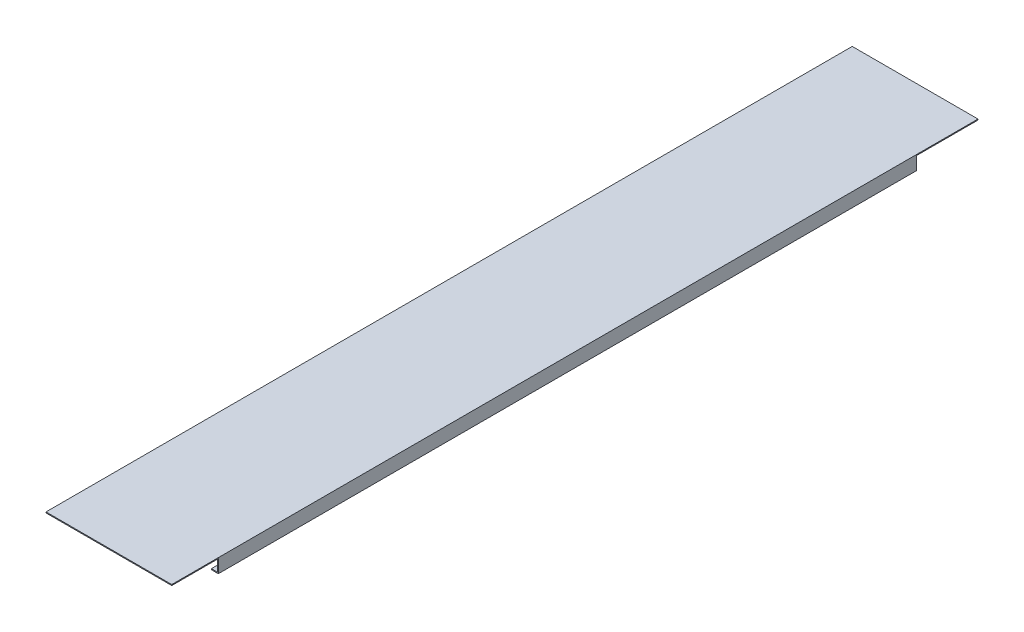
ISO-10303-21;
HEADER;
FILE_DESCRIPTION(('STEP AP214'),'2;1');
FILE_NAME('part.step','',(''),(''),'','','');
FILE_SCHEMA(('AUTOMOTIVE_DESIGN { 1 0 10303 214 1 1 1 1 }'));
ENDSEC;
DATA;
#1=APPLICATION_CONTEXT('core data for automotive mechanical design processes');
#2=APPLICATION_PROTOCOL_DEFINITION('international standard','automotive_design',2000,#1);
#3=PRODUCT_CONTEXT('',#1,'mechanical');
#4=PRODUCT('Part','Part','',(#3));
#5=PRODUCT_RELATED_PRODUCT_CATEGORY('part','',(#4));
#6=PRODUCT_DEFINITION_FORMATION('','',#4);
#7=PRODUCT_DEFINITION_CONTEXT('part definition',#1,'design');
#8=PRODUCT_DEFINITION('design','',#6,#7);
#9=PRODUCT_DEFINITION_SHAPE('','',#8);
#10=(LENGTH_UNIT() NAMED_UNIT(*) SI_UNIT(.MILLI.,.METRE.));
#11=(NAMED_UNIT(*) PLANE_ANGLE_UNIT() SI_UNIT($,.RADIAN.));
#12=(NAMED_UNIT(*) SI_UNIT($,.STERADIAN.) SOLID_ANGLE_UNIT());
#13=UNCERTAINTY_MEASURE_WITH_UNIT(LENGTH_MEASURE(1.E-05),#10,'distance_accuracy_value','');
#14=(GEOMETRIC_REPRESENTATION_CONTEXT(3) GLOBAL_UNCERTAINTY_ASSIGNED_CONTEXT((#13)) GLOBAL_UNIT_ASSIGNED_CONTEXT((#10,
#11,#12)) REPRESENTATION_CONTEXT('',''));
#15=CARTESIAN_POINT('',(0.,0.,0.));
#16=DIRECTION('',(0.,0.,1.));
#17=DIRECTION('',(1.,0.,0.));
#18=AXIS2_PLACEMENT_3D('',#15,#16,#17);
#19=CARTESIAN_POINT('',(-363.,-1048.,2035.));
#20=DIRECTION('',(0.,-1.,0.));
#21=DIRECTION('',(1.,0.,0.));
#22=AXIS2_PLACEMENT_3D('',#19,#20,#21);
#23=PLANE('',#22);
#24=DIRECTION('',(0.,0.,-1.));
#25=VECTOR('',#24,1.);
#26=CARTESIAN_POINT('',(-348.,-1048.,1925.));
#27=LINE('',#26,#25);
#28=CARTESIAN_POINT('',(-348.,-1048.,1925.));
#29=VERTEX_POINT('',#28);
#30=CARTESIAN_POINT('',(-348.,-1048.,426.));
#31=VERTEX_POINT('',#30);
#32=EDGE_CURVE('E194',#29,#31,#27,.T.);
#33=ORIENTED_EDGE('',*,*,#32,.F.);
#34=DIRECTION('',(1.,0.,0.));
#35=VECTOR('',#34,1.);
#36=CARTESIAN_POINT('',(-363.,-1048.,1925.));
#37=LINE('',#36,#35);
#38=CARTESIAN_POINT('',(-363.,-1048.,1925.));
#39=VERTEX_POINT('',#38);
#40=EDGE_CURVE('E36',#39,#29,#37,.T.);
#41=ORIENTED_EDGE('',*,*,#40,.F.);
#42=DIRECTION('',(0.,0.,-1.));
#43=VECTOR('',#42,1.);
#44=CARTESIAN_POINT('',(-363.,-1048.,1925.));
#45=LINE('',#44,#43);
#46=CARTESIAN_POINT('',(-363.,-1048.,426.));
#47=VERTEX_POINT('',#46);
#48=EDGE_CURVE('E11',#39,#47,#45,.T.);
#49=ORIENTED_EDGE('',*,*,#48,.T.);
#50=DIRECTION('',(1.,0.,0.));
#51=VECTOR('',#50,1.);
#52=CARTESIAN_POINT('',(-363.,-1048.,426.));
#53=LINE('',#52,#51);
#54=EDGE_CURVE('E27',#47,#31,#53,.T.);
#55=ORIENTED_EDGE('',*,*,#54,.T.);
#56=EDGE_LOOP('',(#33,#41,#49,#55));
#57=FACE_BOUND('',#56,.T.);
#58=ADVANCED_FACE('F17',(#57),#23,.T.);
#59=CARTESIAN_POINT('',(-618.,-1020.,426.));
#60=DIRECTION('',(0.,0.,1.));
#61=DIRECTION('',(1.,0.,0.));
#62=AXIS2_PLACEMENT_3D('',#59,#60,#61);
#63=PLANE('',#62);
#64=DIRECTION('',(0.,-1.,0.));
#65=VECTOR('',#64,1.);
#66=CARTESIAN_POINT('',(-363.,-1046.,426.));
#67=LINE('',#66,#65);
#68=CARTESIAN_POINT('',(-363.,-1046.,426.));
#69=VERTEX_POINT('',#68);
#70=EDGE_CURVE('E187',#69,#47,#67,.T.);
#71=ORIENTED_EDGE('',*,*,#70,.F.);
#72=DIRECTION('',(-1.,0.,0.));
#73=VECTOR('',#72,1.);
#74=CARTESIAN_POINT('',(-350.,-1046.,426.));
#75=LINE('',#74,#73);
#76=CARTESIAN_POINT('',(-350.,-1046.,426.));
#77=VERTEX_POINT('',#76);
#78=EDGE_CURVE('E108',#77,#69,#75,.T.);
#79=ORIENTED_EDGE('',*,*,#78,.F.);
#80=DIRECTION('',(0.,-1.,0.));
#81=VECTOR('',#80,1.);
#82=CARTESIAN_POINT('',(-350.,-1020.,426.));
#83=LINE('',#82,#81);
#84=CARTESIAN_POINT('',(-350.,-1020.,426.));
#85=VERTEX_POINT('',#84);
#86=EDGE_CURVE('E101',#85,#77,#83,.T.);
#87=ORIENTED_EDGE('',*,*,#86,.F.);
#88=DIRECTION('',(1.,0.,0.));
#89=VECTOR('',#88,1.);
#90=CARTESIAN_POINT('',(-350.,-1020.,426.));
#91=LINE('',#90,#89);
#92=CARTESIAN_POINT('',(-348.,-1020.,426.));
#93=VERTEX_POINT('',#92);
#94=EDGE_CURVE('E106',#85,#93,#91,.T.);
#95=ORIENTED_EDGE('',*,*,#94,.T.);
#96=DIRECTION('',(0.,1.,0.));
#97=VECTOR('',#96,1.);
#98=CARTESIAN_POINT('',(-348.,-1048.,426.));
#99=LINE('',#98,#97);
#100=EDGE_CURVE('E165',#31,#93,#99,.T.);
#101=ORIENTED_EDGE('',*,*,#100,.F.);
#102=ORIENTED_EDGE('',*,*,#54,.F.);
#103=EDGE_LOOP('',(#71,#79,#87,#95,#101,#102));
#104=FACE_BOUND('',#103,.T.);
#105=ADVANCED_FACE('F104',(#104),#63,.F.);
#106=CARTESIAN_POINT('',(-618.,-1020.,426.));
#107=DIRECTION('',(0.,0.,1.));
#108=DIRECTION('',(1.,0.,0.));
#109=AXIS2_PLACEMENT_3D('',#106,#107,#108);
#110=PLANE('',#109);
#111=DIRECTION('',(1.,0.,0.));
#112=VECTOR('',#111,1.);
#113=CARTESIAN_POINT('',(-618.,-1020.,426.));
#114=LINE('',#113,#112);
#115=CARTESIAN_POINT('',(-618.,-1020.,426.));
#116=VERTEX_POINT('',#115);
#117=CARTESIAN_POINT('',(-616.,-1020.,426.));
#118=VERTEX_POINT('',#117);
#119=EDGE_CURVE('E123',#116,#118,#114,.T.);
#120=ORIENTED_EDGE('',*,*,#119,.T.);
#121=DIRECTION('',(0.,1.,0.));
#122=VECTOR('',#121,1.);
#123=CARTESIAN_POINT('',(-616.,-1046.,426.));
#124=LINE('',#123,#122);
#125=CARTESIAN_POINT('',(-616.,-1046.,426.));
#126=VERTEX_POINT('',#125);
#127=EDGE_CURVE('E149',#126,#118,#124,.T.);
#128=ORIENTED_EDGE('',*,*,#127,.F.);
#129=DIRECTION('',(-1.,0.,0.));
#130=VECTOR('',#129,1.);
#131=CARTESIAN_POINT('',(-603.,-1046.,426.));
#132=LINE('',#131,#130);
#133=CARTESIAN_POINT('',(-603.,-1046.,426.));
#134=VERTEX_POINT('',#133);
#135=EDGE_CURVE('E148',#134,#126,#132,.T.);
#136=ORIENTED_EDGE('',*,*,#135,.F.);
#137=DIRECTION('',(0.,1.,0.));
#138=VECTOR('',#137,1.);
#139=CARTESIAN_POINT('',(-603.,-1048.,426.));
#140=LINE('',#139,#138);
#141=CARTESIAN_POINT('',(-603.,-1048.,426.));
#142=VERTEX_POINT('',#141);
#143=EDGE_CURVE('E183',#142,#134,#140,.T.);
#144=ORIENTED_EDGE('',*,*,#143,.F.);
#145=DIRECTION('',(1.,0.,0.));
#146=VECTOR('',#145,1.);
#147=CARTESIAN_POINT('',(-618.,-1048.,426.));
#148=LINE('',#147,#146);
#149=CARTESIAN_POINT('',(-618.,-1048.,426.));
#150=VERTEX_POINT('',#149);
#151=EDGE_CURVE('E150',#150,#142,#148,.T.);
#152=ORIENTED_EDGE('',*,*,#151,.F.);
#153=DIRECTION('',(0.,1.,0.));
#154=VECTOR('',#153,1.);
#155=CARTESIAN_POINT('',(-618.,-1048.,426.));
#156=LINE('',#155,#154);
#157=EDGE_CURVE('E180',#150,#116,#156,.T.);
#158=ORIENTED_EDGE('',*,*,#157,.T.);
#159=EDGE_LOOP('',(#120,#128,#136,#144,#152,#158));
#160=FACE_BOUND('',#159,.T.);
#161=ADVANCED_FACE('F307',(#160),#110,.F.);
#162=CARTESIAN_POINT('',(-348.,-1048.,2035.));
#163=DIRECTION('',(1.,0.,0.));
#164=DIRECTION('',(0.,0.,1.));
#165=AXIS2_PLACEMENT_3D('',#162,#163,#164);
#166=PLANE('',#165);
#167=DIRECTION('',(0.,0.,1.));
#168=VECTOR('',#167,1.);
#169=CARTESIAN_POINT('',(-348.,-1020.,1925.));
#170=LINE('',#169,#168);
#171=CARTESIAN_POINT('',(-348.,-1020.,1925.));
#172=VERTEX_POINT('',#171);
#173=CARTESIAN_POINT('',(-348.,-1020.,2025.));
#174=VERTEX_POINT('',#173);
#175=EDGE_CURVE('E134',#172,#174,#170,.T.);
#176=ORIENTED_EDGE('',*,*,#175,.F.);
#177=DIRECTION('',(0.,1.,0.));
#178=VECTOR('',#177,1.);
#179=CARTESIAN_POINT('',(-348.,-1048.,1925.));
#180=LINE('',#179,#178);
#181=EDGE_CURVE('E170',#29,#172,#180,.T.);
#182=ORIENTED_EDGE('',*,*,#181,.F.);
#183=ORIENTED_EDGE('',*,*,#32,.T.);
#184=ORIENTED_EDGE('',*,*,#100,.T.);
#185=DIRECTION('',(0.,0.,1.));
#186=VECTOR('',#185,1.);
#187=CARTESIAN_POINT('',(-348.,-1020.,294.));
#188=LINE('',#187,#186);
#189=CARTESIAN_POINT('',(-348.,-1020.,294.));
#190=VERTEX_POINT('',#189);
#191=EDGE_CURVE('E122',#190,#93,#188,.T.);
#192=ORIENTED_EDGE('',*,*,#191,.F.);
#193=DIRECTION('',(0.,1.,0.));
#194=VECTOR('',#193,1.);
#195=CARTESIAN_POINT('',(-348.,-1020.,294.));
#196=LINE('',#195,#194);
#197=CARTESIAN_POINT('',(-348.,-1018.,294.));
#198=VERTEX_POINT('',#197);
#199=EDGE_CURVE('E158',#190,#198,#196,.T.);
#200=ORIENTED_EDGE('',*,*,#199,.T.);
#201=DIRECTION('',(0.,0.,-1.));
#202=VECTOR('',#201,1.);
#203=CARTESIAN_POINT('',(-348.,-1018.,2025.));
#204=LINE('',#203,#202);
#205=CARTESIAN_POINT('',(-348.,-1018.,2025.));
#206=VERTEX_POINT('',#205);
#207=EDGE_CURVE('E162',#206,#198,#204,.T.);
#208=ORIENTED_EDGE('',*,*,#207,.F.);
#209=DIRECTION('',(0.,1.,0.));
#210=VECTOR('',#209,1.);
#211=CARTESIAN_POINT('',(-348.,-1020.,2025.));
#212=LINE('',#211,#210);
#213=EDGE_CURVE('E155',#174,#206,#212,.T.);
#214=ORIENTED_EDGE('',*,*,#213,.F.);
#215=EDGE_LOOP('',(#176,#182,#183,#184,#192,#200,#208,#214));
#216=FACE_BOUND('',#215,.T.);
#217=ADVANCED_FACE('F248',(#216),#166,.T.);
#218=CARTESIAN_POINT('',(-348.,-1018.,2025.));
#219=DIRECTION('',(0.,0.,-1.));
#220=DIRECTION('',(0.,1.,0.));
#221=AXIS2_PLACEMENT_3D('',#218,#219,#220);
#222=PLANE('',#221);
#223=ORIENTED_EDGE('',*,*,#213,.T.);
#224=DIRECTION('',(-1.,0.,0.));
#225=VECTOR('',#224,1.);
#226=CARTESIAN_POINT('',(-348.,-1018.,2025.));
#227=LINE('',#226,#225);
#228=CARTESIAN_POINT('',(-618.,-1018.,2025.));
#229=VERTEX_POINT('',#228);
#230=EDGE_CURVE('E159',#206,#229,#227,.T.);
#231=ORIENTED_EDGE('',*,*,#230,.T.);
#232=DIRECTION('',(0.,-1.,0.));
#233=VECTOR('',#232,1.);
#234=CARTESIAN_POINT('',(-618.,-1018.,2025.));
#235=LINE('',#234,#233);
#236=CARTESIAN_POINT('',(-618.,-1020.,2025.));
#237=VERTEX_POINT('',#236);
#238=EDGE_CURVE('E191',#229,#237,#235,.T.);
#239=ORIENTED_EDGE('',*,*,#238,.T.);
#240=DIRECTION('',(1.,0.,0.));
#241=VECTOR('',#240,1.);
#242=CARTESIAN_POINT('',(-618.,-1020.,2025.));
#243=LINE('',#242,#241);
#244=EDGE_CURVE('E188',#237,#174,#243,.T.);
#245=ORIENTED_EDGE('',*,*,#244,.T.);
#246=EDGE_LOOP('',(#223,#231,#239,#245));
#247=FACE_BOUND('',#246,.T.);
#248=ADVANCED_FACE('F270',(#247),#222,.F.);
#249=CARTESIAN_POINT('',(-616.,-1020.,2035.));
#250=DIRECTION('',(0.,-1.,0.));
#251=DIRECTION('',(1.,0.,0.));
#252=AXIS2_PLACEMENT_3D('',#249,#250,#251);
#253=PLANE('',#252);
#254=DIRECTION('',(0.,0.,1.));
#255=VECTOR('',#254,1.);
#256=CARTESIAN_POINT('',(-618.,-1020.,1925.));
#257=LINE('',#256,#255);
#258=CARTESIAN_POINT('',(-618.,-1020.,1925.));
#259=VERTEX_POINT('',#258);
#260=EDGE_CURVE('E21',#259,#237,#257,.T.);
#261=ORIENTED_EDGE('',*,*,#260,.F.);
#262=DIRECTION('',(-1.,0.,0.));
#263=VECTOR('',#262,1.);
#264=CARTESIAN_POINT('',(-616.,-1020.,1925.));
#265=LINE('',#264,#263);
#266=CARTESIAN_POINT('',(-616.,-1020.,1925.));
#267=VERTEX_POINT('',#266);
#268=EDGE_CURVE('E168',#267,#259,#265,.T.);
#269=ORIENTED_EDGE('',*,*,#268,.F.);
#270=DIRECTION('',(0.,0.,-1.));
#271=VECTOR('',#270,1.);
#272=CARTESIAN_POINT('',(-616.,-1020.,1925.));
#273=LINE('',#272,#271);
#274=EDGE_CURVE('E192',#267,#118,#273,.T.);
#275=ORIENTED_EDGE('',*,*,#274,.T.);
#276=ORIENTED_EDGE('',*,*,#119,.F.);
#277=DIRECTION('',(0.,0.,1.));
#278=VECTOR('',#277,1.);
#279=CARTESIAN_POINT('',(-618.,-1020.,294.));
#280=LINE('',#279,#278);
#281=CARTESIAN_POINT('',(-618.,-1020.,294.));
#282=VERTEX_POINT('',#281);
#283=EDGE_CURVE('E144',#282,#116,#280,.T.);
#284=ORIENTED_EDGE('',*,*,#283,.F.);
#285=DIRECTION('',(1.,0.,0.));
#286=VECTOR('',#285,1.);
#287=CARTESIAN_POINT('',(-618.,-1020.,294.));
#288=LINE('',#287,#286);
#289=EDGE_CURVE('E215',#282,#190,#288,.T.);
#290=ORIENTED_EDGE('',*,*,#289,.T.);
#291=ORIENTED_EDGE('',*,*,#191,.T.);
#292=ORIENTED_EDGE('',*,*,#94,.F.);
#293=DIRECTION('',(0.,0.,-1.));
#294=VECTOR('',#293,1.);
#295=CARTESIAN_POINT('',(-350.,-1020.,1925.));
#296=LINE('',#295,#294);
#297=CARTESIAN_POINT('',(-350.,-1020.,1925.));
#298=VERTEX_POINT('',#297);
#299=EDGE_CURVE('E113',#298,#85,#296,.T.);
#300=ORIENTED_EDGE('',*,*,#299,.F.);
#301=DIRECTION('',(-1.,0.,0.));
#302=VECTOR('',#301,1.);
#303=CARTESIAN_POINT('',(-348.,-1020.,1925.));
#304=LINE('',#303,#302);
#305=EDGE_CURVE('E172',#172,#298,#304,.T.);
#306=ORIENTED_EDGE('',*,*,#305,.F.);
#307=ORIENTED_EDGE('',*,*,#175,.T.);
#308=ORIENTED_EDGE('',*,*,#244,.F.);
#309=EDGE_LOOP('',(#261,#269,#275,#276,#284,#290,#291,#292,#300,#306,#307,#308));
#310=FACE_BOUND('',#309,.T.);
#311=ADVANCED_FACE('F118',(#310),#253,.T.);
#312=CARTESIAN_POINT('',(-348.,-1020.,1925.));
#313=DIRECTION('',(0.,0.,-1.));
#314=DIRECTION('',(0.,1.,0.));
#315=AXIS2_PLACEMENT_3D('',#312,#313,#314);
#316=PLANE('',#315);
#317=ORIENTED_EDGE('',*,*,#181,.T.);
#318=ORIENTED_EDGE('',*,*,#305,.T.);
#319=DIRECTION('',(0.,-1.,0.));
#320=VECTOR('',#319,1.);
#321=CARTESIAN_POINT('',(-350.,-1020.,1925.));
#322=LINE('',#321,#320);
#323=CARTESIAN_POINT('',(-350.,-1046.,1925.));
#324=VERTEX_POINT('',#323);
#325=EDGE_CURVE('E128',#298,#324,#322,.T.);
#326=ORIENTED_EDGE('',*,*,#325,.T.);
#327=DIRECTION('',(-1.,0.,0.));
#328=VECTOR('',#327,1.);
#329=CARTESIAN_POINT('',(-350.,-1046.,1925.));
#330=LINE('',#329,#328);
#331=CARTESIAN_POINT('',(-363.,-1046.,1925.));
#332=VERTEX_POINT('',#331);
#333=EDGE_CURVE('E223',#324,#332,#330,.T.);
#334=ORIENTED_EDGE('',*,*,#333,.T.);
#335=DIRECTION('',(0.,-1.,0.));
#336=VECTOR('',#335,1.);
#337=CARTESIAN_POINT('',(-363.,-1046.,1925.));
#338=LINE('',#337,#336);
#339=EDGE_CURVE('E228',#332,#39,#338,.T.);
#340=ORIENTED_EDGE('',*,*,#339,.T.);
#341=ORIENTED_EDGE('',*,*,#40,.T.);
#342=EDGE_LOOP('',(#317,#318,#326,#334,#340,#341));
#343=FACE_BOUND('',#342,.T.);
#344=ADVANCED_FACE('F323',(#343),#316,.F.);
#345=CARTESIAN_POINT('',(-348.,-1020.,1925.));
#346=DIRECTION('',(0.,0.,-1.));
#347=DIRECTION('',(0.,1.,0.));
#348=AXIS2_PLACEMENT_3D('',#345,#346,#347);
#349=PLANE('',#348);
#350=DIRECTION('',(1.,0.,0.));
#351=VECTOR('',#350,1.);
#352=CARTESIAN_POINT('',(-618.,-1048.,1925.));
#353=LINE('',#352,#351);
#354=CARTESIAN_POINT('',(-618.,-1048.,1925.));
#355=VERTEX_POINT('',#354);
#356=CARTESIAN_POINT('',(-603.,-1048.,1925.));
#357=VERTEX_POINT('',#356);
#358=EDGE_CURVE('E139',#355,#357,#353,.T.);
#359=ORIENTED_EDGE('',*,*,#358,.T.);
#360=DIRECTION('',(0.,1.,0.));
#361=VECTOR('',#360,1.);
#362=CARTESIAN_POINT('',(-603.,-1048.,1925.));
#363=LINE('',#362,#361);
#364=CARTESIAN_POINT('',(-603.,-1046.,1925.));
#365=VERTEX_POINT('',#364);
#366=EDGE_CURVE('E136',#357,#365,#363,.T.);
#367=ORIENTED_EDGE('',*,*,#366,.T.);
#368=DIRECTION('',(-1.,0.,0.));
#369=VECTOR('',#368,1.);
#370=CARTESIAN_POINT('',(-603.,-1046.,1925.));
#371=LINE('',#370,#369);
#372=CARTESIAN_POINT('',(-616.,-1046.,1925.));
#373=VERTEX_POINT('',#372);
#374=EDGE_CURVE('E140',#365,#373,#371,.T.);
#375=ORIENTED_EDGE('',*,*,#374,.T.);
#376=DIRECTION('',(0.,1.,0.));
#377=VECTOR('',#376,1.);
#378=CARTESIAN_POINT('',(-616.,-1046.,1925.));
#379=LINE('',#378,#377);
#380=EDGE_CURVE('E166',#373,#267,#379,.T.);
#381=ORIENTED_EDGE('',*,*,#380,.T.);
#382=ORIENTED_EDGE('',*,*,#268,.T.);
#383=DIRECTION('',(0.,1.,0.));
#384=VECTOR('',#383,1.);
#385=CARTESIAN_POINT('',(-618.,-1048.,1925.));
#386=LINE('',#385,#384);
#387=EDGE_CURVE('E173',#355,#259,#386,.T.);
#388=ORIENTED_EDGE('',*,*,#387,.F.);
#389=EDGE_LOOP('',(#359,#367,#375,#381,#382,#388));
#390=FACE_BOUND('',#389,.T.);
#391=ADVANCED_FACE('F200',(#390),#349,.F.);
#392=CARTESIAN_POINT('',(-363.,-1046.,2035.));
#393=DIRECTION('',(-1.,0.,0.));
#394=DIRECTION('',(0.,-1.,0.));
#395=AXIS2_PLACEMENT_3D('',#392,#393,#394);
#396=PLANE('',#395);
#397=ORIENTED_EDGE('',*,*,#48,.F.);
#398=ORIENTED_EDGE('',*,*,#339,.F.);
#399=DIRECTION('',(0.,0.,-1.));
#400=VECTOR('',#399,1.);
#401=CARTESIAN_POINT('',(-363.,-1046.,1925.));
#402=LINE('',#401,#400);
#403=EDGE_CURVE('E184',#332,#69,#402,.T.);
#404=ORIENTED_EDGE('',*,*,#403,.T.);
#405=ORIENTED_EDGE('',*,*,#70,.T.);
#406=EDGE_LOOP('',(#397,#398,#404,#405));
#407=FACE_BOUND('',#406,.T.);
#408=ADVANCED_FACE('F314',(#407),#396,.T.);
#409=CARTESIAN_POINT('',(-350.,-1046.,2035.));
#410=DIRECTION('',(0.,1.,0.));
#411=DIRECTION('',(0.,0.,-1.));
#412=AXIS2_PLACEMENT_3D('',#409,#410,#411);
#413=PLANE('',#412);
#414=ORIENTED_EDGE('',*,*,#403,.F.);
#415=ORIENTED_EDGE('',*,*,#333,.F.);
#416=DIRECTION('',(0.,0.,-1.));
#417=VECTOR('',#416,1.);
#418=CARTESIAN_POINT('',(-350.,-1046.,1925.));
#419=LINE('',#418,#417);
#420=EDGE_CURVE('E130',#324,#77,#419,.T.);
#421=ORIENTED_EDGE('',*,*,#420,.T.);
#422=ORIENTED_EDGE('',*,*,#78,.T.);
#423=EDGE_LOOP('',(#414,#415,#421,#422));
#424=FACE_BOUND('',#423,.T.);
#425=ADVANCED_FACE('F311',(#424),#413,.T.);
#426=CARTESIAN_POINT('',(-350.,-1020.,2035.));
#427=DIRECTION('',(-1.,0.,0.));
#428=DIRECTION('',(0.,-1.,0.));
#429=AXIS2_PLACEMENT_3D('',#426,#427,#428);
#430=PLANE('',#429);
#431=ORIENTED_EDGE('',*,*,#420,.F.);
#432=ORIENTED_EDGE('',*,*,#325,.F.);
#433=ORIENTED_EDGE('',*,*,#299,.T.);
#434=ORIENTED_EDGE('',*,*,#86,.T.);
#435=EDGE_LOOP('',(#431,#432,#433,#434));
#436=FACE_BOUND('',#435,.T.);
#437=ADVANCED_FACE('F126',(#436),#430,.T.);
#438=CARTESIAN_POINT('',(-618.,-1018.,2035.));
#439=DIRECTION('',(-1.,0.,0.));
#440=DIRECTION('',(0.,-1.,0.));
#441=AXIS2_PLACEMENT_3D('',#438,#439,#440);
#442=PLANE('',#441);
#443=DIRECTION('',(0.,0.,-1.));
#444=VECTOR('',#443,1.);
#445=CARTESIAN_POINT('',(-618.,-1018.,2025.));
#446=LINE('',#445,#444);
#447=CARTESIAN_POINT('',(-618.,-1018.,294.));
#448=VERTEX_POINT('',#447);
#449=EDGE_CURVE('E114',#229,#448,#446,.T.);
#450=ORIENTED_EDGE('',*,*,#449,.T.);
#451=DIRECTION('',(0.,-1.,0.));
#452=VECTOR('',#451,1.);
#453=CARTESIAN_POINT('',(-618.,-1018.,294.));
#454=LINE('',#453,#452);
#455=EDGE_CURVE('E141',#448,#282,#454,.T.);
#456=ORIENTED_EDGE('',*,*,#455,.T.);
#457=ORIENTED_EDGE('',*,*,#283,.T.);
#458=ORIENTED_EDGE('',*,*,#157,.F.);
#459=DIRECTION('',(0.,0.,-1.));
#460=VECTOR('',#459,1.);
#461=CARTESIAN_POINT('',(-618.,-1048.,1925.));
#462=LINE('',#461,#460);
#463=EDGE_CURVE('E152',#355,#150,#462,.T.);
#464=ORIENTED_EDGE('',*,*,#463,.F.);
#465=ORIENTED_EDGE('',*,*,#387,.T.);
#466=ORIENTED_EDGE('',*,*,#260,.T.);
#467=ORIENTED_EDGE('',*,*,#238,.F.);
#468=EDGE_LOOP('',(#450,#456,#457,#458,#464,#465,#466,#467));
#469=FACE_BOUND('',#468,.T.);
#470=ADVANCED_FACE('F236',(#469),#442,.T.);
#471=CARTESIAN_POINT('',(-618.,-1048.,2035.));
#472=DIRECTION('',(0.,-1.,0.));
#473=DIRECTION('',(1.,0.,0.));
#474=AXIS2_PLACEMENT_3D('',#471,#472,#473);
#475=PLANE('',#474);
#476=DIRECTION('',(0.,0.,-1.));
#477=VECTOR('',#476,1.);
#478=CARTESIAN_POINT('',(-603.,-1048.,1925.));
#479=LINE('',#478,#477);
#480=EDGE_CURVE('E153',#357,#142,#479,.T.);
#481=ORIENTED_EDGE('',*,*,#480,.F.);
#482=ORIENTED_EDGE('',*,*,#358,.F.);
#483=ORIENTED_EDGE('',*,*,#463,.T.);
#484=ORIENTED_EDGE('',*,*,#151,.T.);
#485=EDGE_LOOP('',(#481,#482,#483,#484));
#486=FACE_BOUND('',#485,.T.);
#487=ADVANCED_FACE('F276',(#486),#475,.T.);
#488=CARTESIAN_POINT('',(-603.,-1048.,2035.));
#489=DIRECTION('',(1.,0.,0.));
#490=DIRECTION('',(0.,0.,1.));
#491=AXIS2_PLACEMENT_3D('',#488,#489,#490);
#492=PLANE('',#491);
#493=DIRECTION('',(0.,0.,-1.));
#494=VECTOR('',#493,1.);
#495=CARTESIAN_POINT('',(-603.,-1046.,1925.));
#496=LINE('',#495,#494);
#497=EDGE_CURVE('E226',#365,#134,#496,.T.);
#498=ORIENTED_EDGE('',*,*,#497,.F.);
#499=ORIENTED_EDGE('',*,*,#366,.F.);
#500=ORIENTED_EDGE('',*,*,#480,.T.);
#501=ORIENTED_EDGE('',*,*,#143,.T.);
#502=EDGE_LOOP('',(#498,#499,#500,#501));
#503=FACE_BOUND('',#502,.T.);
#504=ADVANCED_FACE('F318',(#503),#492,.T.);
#505=CARTESIAN_POINT('',(-603.,-1046.,2035.));
#506=DIRECTION('',(0.,1.,0.));
#507=DIRECTION('',(0.,0.,-1.));
#508=AXIS2_PLACEMENT_3D('',#505,#506,#507);
#509=PLANE('',#508);
#510=DIRECTION('',(0.,0.,-1.));
#511=VECTOR('',#510,1.);
#512=CARTESIAN_POINT('',(-616.,-1046.,1925.));
#513=LINE('',#512,#511);
#514=EDGE_CURVE('E145',#373,#126,#513,.T.);
#515=ORIENTED_EDGE('',*,*,#514,.F.);
#516=ORIENTED_EDGE('',*,*,#374,.F.);
#517=ORIENTED_EDGE('',*,*,#497,.T.);
#518=ORIENTED_EDGE('',*,*,#135,.T.);
#519=EDGE_LOOP('',(#515,#516,#517,#518));
#520=FACE_BOUND('',#519,.T.);
#521=ADVANCED_FACE('F209',(#520),#509,.T.);
#522=CARTESIAN_POINT('',(-616.,-1046.,2035.));
#523=DIRECTION('',(1.,0.,0.));
#524=DIRECTION('',(0.,0.,1.));
#525=AXIS2_PLACEMENT_3D('',#522,#523,#524);
#526=PLANE('',#525);
#527=ORIENTED_EDGE('',*,*,#274,.F.);
#528=ORIENTED_EDGE('',*,*,#380,.F.);
#529=ORIENTED_EDGE('',*,*,#514,.T.);
#530=ORIENTED_EDGE('',*,*,#127,.T.);
#531=EDGE_LOOP('',(#527,#528,#529,#530));
#532=FACE_BOUND('',#531,.T.);
#533=ADVANCED_FACE('F212',(#532),#526,.T.);
#534=CARTESIAN_POINT('',(-618.,-1018.,294.));
#535=DIRECTION('',(0.,0.,1.));
#536=DIRECTION('',(1.,0.,0.));
#537=AXIS2_PLACEMENT_3D('',#534,#535,#536);
#538=PLANE('',#537);
#539=ORIENTED_EDGE('',*,*,#455,.F.);
#540=DIRECTION('',(-1.,0.,0.));
#541=VECTOR('',#540,1.);
#542=CARTESIAN_POINT('',(-348.,-1018.,294.));
#543=LINE('',#542,#541);
#544=EDGE_CURVE('E220',#198,#448,#543,.T.);
#545=ORIENTED_EDGE('',*,*,#544,.F.);
#546=ORIENTED_EDGE('',*,*,#199,.F.);
#547=ORIENTED_EDGE('',*,*,#289,.F.);
#548=EDGE_LOOP('',(#539,#545,#546,#547));
#549=FACE_BOUND('',#548,.T.);
#550=ADVANCED_FACE('F19',(#549),#538,.F.);
#551=CARTESIAN_POINT('',(-348.,-1018.,2035.));
#552=DIRECTION('',(0.,1.,0.));
#553=DIRECTION('',(0.,0.,-1.));
#554=AXIS2_PLACEMENT_3D('',#551,#552,#553);
#555=PLANE('',#554);
#556=ORIENTED_EDGE('',*,*,#207,.T.);
#557=ORIENTED_EDGE('',*,*,#544,.T.);
#558=ORIENTED_EDGE('',*,*,#449,.F.);
#559=ORIENTED_EDGE('',*,*,#230,.F.);
#560=EDGE_LOOP('',(#556,#557,#558,#559));
#561=FACE_BOUND('',#560,.T.);
#562=ADVANCED_FACE('F292',(#561),#555,.T.);
#563=CLOSED_SHELL('',(#58,#105,#161,#217,#248,#311,#344,#391,#408,#425,#437,#470,#487,#504,#521,
#533,#550,#562));
#564=MANIFOLD_SOLID_BREP('B1',#563);
#565=ADVANCED_BREP_SHAPE_REPRESENTATION('',(#18,#564),#14);
#566=SHAPE_DEFINITION_REPRESENTATION(#9,#565);
ENDSEC;
END-ISO-10303-21;
